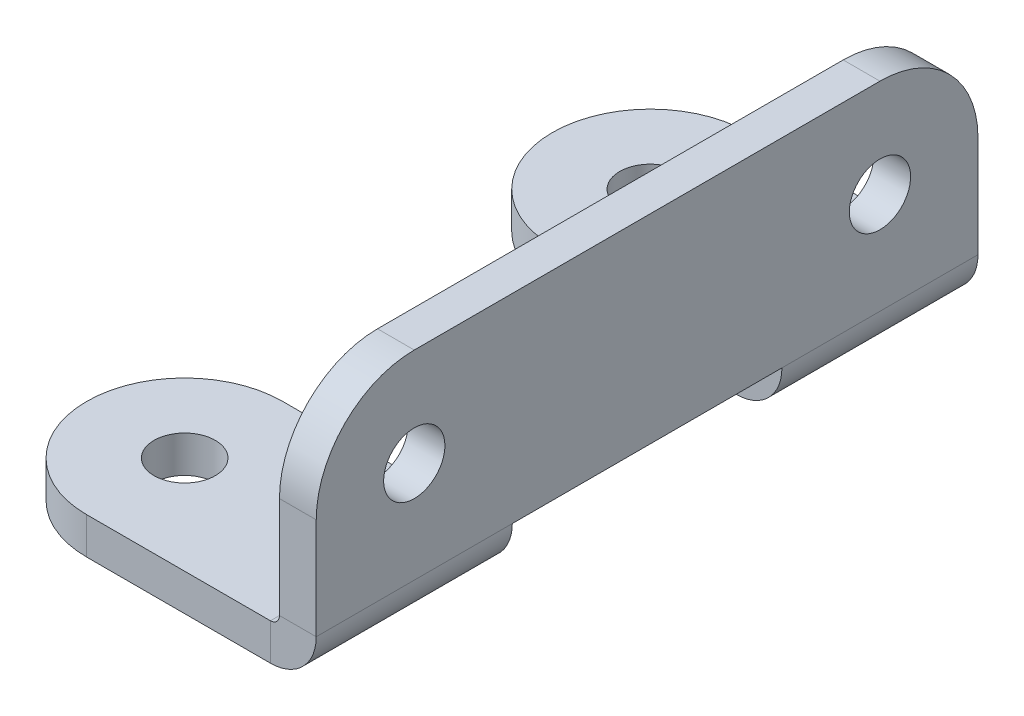
ISO-10303-21;
HEADER;
FILE_DESCRIPTION(('STEP AP214'),'2;1');
FILE_NAME('part.step','',(''),(''),'','','');
FILE_SCHEMA(('AUTOMOTIVE_DESIGN { 1 0 10303 214 1 1 1 1 }'));
ENDSEC;
DATA;
#1=APPLICATION_CONTEXT('core data for automotive mechanical design processes');
#2=APPLICATION_PROTOCOL_DEFINITION('international standard','automotive_design',2000,#1);
#3=PRODUCT_CONTEXT('',#1,'mechanical');
#4=PRODUCT('Part','Part','',(#3));
#5=PRODUCT_RELATED_PRODUCT_CATEGORY('part','',(#4));
#6=PRODUCT_DEFINITION_FORMATION('','',#4);
#7=PRODUCT_DEFINITION_CONTEXT('part definition',#1,'design');
#8=PRODUCT_DEFINITION('design','',#6,#7);
#9=PRODUCT_DEFINITION_SHAPE('','',#8);
#10=(LENGTH_UNIT() NAMED_UNIT(*) SI_UNIT(.MILLI.,.METRE.));
#11=(NAMED_UNIT(*) PLANE_ANGLE_UNIT() SI_UNIT($,.RADIAN.));
#12=(NAMED_UNIT(*) SI_UNIT($,.STERADIAN.) SOLID_ANGLE_UNIT());
#13=UNCERTAINTY_MEASURE_WITH_UNIT(LENGTH_MEASURE(1.E-05),#10,'distance_accuracy_value','');
#14=(GEOMETRIC_REPRESENTATION_CONTEXT(3) GLOBAL_UNCERTAINTY_ASSIGNED_CONTEXT((#13)) GLOBAL_UNIT_ASSIGNED_CONTEXT((#10,
#11,#12)) REPRESENTATION_CONTEXT('',''));
#15=CARTESIAN_POINT('',(0.,0.,0.));
#16=DIRECTION('',(0.,0.,1.));
#17=DIRECTION('',(1.,0.,0.));
#18=AXIS2_PLACEMENT_3D('',#15,#16,#17);
#19=CARTESIAN_POINT('',(18.7366,0.,0.));
#20=DIRECTION('',(-1.,0.,0.));
#21=DIRECTION('',(0.,-1.,0.));
#22=AXIS2_PLACEMENT_3D('',#19,#20,#21);
#23=PLANE('',#22);
#24=DIRECTION('',(0.,0.,1.));
#25=VECTOR('',#24,1.);
#26=CARTESIAN_POINT('',(18.7366,0.736599999999985,-8.));
#27=LINE('',#26,#25);
#28=CARTESIAN_POINT('',(18.7366,0.736599999999985,-30.));
#29=VERTEX_POINT('',#28);
#30=CARTESIAN_POINT('',(18.7366,0.736599999999985,-8.));
#31=VERTEX_POINT('',#30);
#32=EDGE_CURVE('E294',#29,#31,#27,.T.);
#33=ORIENTED_EDGE('',*,*,#32,.F.);
#34=DIRECTION('',(0.,0.,1.));
#35=VECTOR('',#34,1.);
#36=CARTESIAN_POINT('',(18.7366,0.736599999999987,-46.));
#37=LINE('',#36,#35);
#38=CARTESIAN_POINT('',(18.7366,0.736599999999986,-46.));
#39=VERTEX_POINT('',#38);
#40=EDGE_CURVE('E239',#29,#39,#37,.F.);
#41=ORIENTED_EDGE('',*,*,#40,.T.);
#42=DIRECTION('',(0.,-1.,0.));
#43=VECTOR('',#42,1.);
#44=CARTESIAN_POINT('',(18.7366,0.,-46.));
#45=LINE('',#44,#43);
#46=CARTESIAN_POINT('',(18.7366,9.00000000000001,-46.));
#47=VERTEX_POINT('',#46);
#48=EDGE_CURVE('E238',#47,#39,#45,.T.);
#49=ORIENTED_EDGE('',*,*,#48,.F.);
#50=CARTESIAN_POINT('',(18.7366,9.,-38.));
#51=DIRECTION('',(1.,0.,0.));
#52=DIRECTION('',(0.,-1.,0.));
#53=AXIS2_PLACEMENT_3D('',#50,#51,#52);
#54=CIRCLE('',#53,8.);
#55=CARTESIAN_POINT('',(18.7366000000001,17.,-38.));
#56=VERTEX_POINT('',#55);
#57=EDGE_CURVE('E220',#56,#47,#54,.F.);
#58=ORIENTED_EDGE('',*,*,#57,.F.);
#59=DIRECTION('',(0.,0.,-1.));
#60=VECTOR('',#59,1.);
#61=CARTESIAN_POINT('',(18.7366000000001,17.,-38.));
#62=LINE('',#61,#60);
#63=CARTESIAN_POINT('',(18.7366000000001,17.,0.));
#64=VERTEX_POINT('',#63);
#65=EDGE_CURVE('E297',#64,#56,#62,.T.);
#66=ORIENTED_EDGE('',*,*,#65,.F.);
#67=CARTESIAN_POINT('',(18.7366,9.,0.));
#68=DIRECTION('',(-1.,0.,0.));
#69=DIRECTION('',(0.,-1.,0.));
#70=AXIS2_PLACEMENT_3D('',#67,#68,#69);
#71=CIRCLE('',#70,8.);
#72=CARTESIAN_POINT('',(18.7366,9.00000000000001,8.));
#73=VERTEX_POINT('',#72);
#74=EDGE_CURVE('E99',#64,#73,#71,.F.);
#75=ORIENTED_EDGE('',*,*,#74,.T.);
#76=DIRECTION('',(0.,-1.,0.));
#77=VECTOR('',#76,1.);
#78=CARTESIAN_POINT('',(18.7366,0.,8.));
#79=LINE('',#78,#77);
#80=CARTESIAN_POINT('',(18.7366,0.736599999999986,8.));
#81=VERTEX_POINT('',#80);
#82=EDGE_CURVE('E319',#73,#81,#79,.T.);
#83=ORIENTED_EDGE('',*,*,#82,.T.);
#84=DIRECTION('',(0.,0.,-1.));
#85=VECTOR('',#84,1.);
#86=CARTESIAN_POINT('',(18.7366,0.736599999999987,8.));
#87=LINE('',#86,#85);
#88=EDGE_CURVE('E324',#31,#81,#87,.F.);
#89=ORIENTED_EDGE('',*,*,#88,.F.);
#90=EDGE_LOOP('',(#33,#41,#49,#58,#66,#75,#83,#89));
#91=FACE_BOUND('',#90,.T.);
#92=CARTESIAN_POINT('',(18.7366,9.,0.));
#93=DIRECTION('',(-1.,0.,0.));
#94=DIRECTION('',(0.,-1.,0.));
#95=AXIS2_PLACEMENT_3D('',#92,#93,#94);
#96=CIRCLE('',#95,2.5);
#97=CARTESIAN_POINT('',(18.7366,6.5,0.));
#98=VERTEX_POINT('',#97);
#99=EDGE_CURVE('E312',#98,#98,#96,.T.);
#100=ORIENTED_EDGE('',*,*,#99,.T.);
#101=EDGE_LOOP('',(#100));
#102=FACE_BOUND('',#101,.T.);
#103=CARTESIAN_POINT('',(18.7366,9.,-38.));
#104=DIRECTION('',(1.,0.,0.));
#105=DIRECTION('',(0.,-1.,0.));
#106=AXIS2_PLACEMENT_3D('',#103,#104,#105);
#107=CIRCLE('',#106,2.5);
#108=CARTESIAN_POINT('',(18.7366,6.5,-38.));
#109=VERTEX_POINT('',#108);
#110=EDGE_CURVE('E221',#109,#109,#107,.T.);
#111=ORIENTED_EDGE('',*,*,#110,.F.);
#112=EDGE_LOOP('',(#111));
#113=FACE_BOUND('',#112,.T.);
#114=ADVANCED_FACE('F85',(#91,#102,#113),#23,.F.);
#115=CARTESIAN_POINT('',(15.7366,0.,0.));
#116=DIRECTION('',(-1.,0.,0.));
#117=DIRECTION('',(0.,-1.,0.));
#118=AXIS2_PLACEMENT_3D('',#115,#116,#117);
#119=PLANE('',#118);
#120=DIRECTION('',(0.,0.,1.));
#121=VECTOR('',#120,1.);
#122=CARTESIAN_POINT('',(15.7366,0.736599999999997,-46.));
#123=LINE('',#122,#121);
#124=CARTESIAN_POINT('',(15.7366,0.736599999999997,-46.));
#125=VERTEX_POINT('',#124);
#126=CARTESIAN_POINT('',(15.7366,0.736599999999995,-30.));
#127=VERTEX_POINT('',#126);
#128=EDGE_CURVE('E244',#125,#127,#123,.T.);
#129=ORIENTED_EDGE('',*,*,#128,.T.);
#130=DIRECTION('',(0.,0.,1.));
#131=VECTOR('',#130,1.);
#132=CARTESIAN_POINT('',(15.7366,0.736599999999996,-8.));
#133=LINE('',#132,#131);
#134=CARTESIAN_POINT('',(15.7366,0.736599999999995,-8.));
#135=VERTEX_POINT('',#134);
#136=EDGE_CURVE('E230',#127,#135,#133,.T.);
#137=ORIENTED_EDGE('',*,*,#136,.T.);
#138=DIRECTION('',(0.,0.,-1.));
#139=VECTOR('',#138,1.);
#140=CARTESIAN_POINT('',(15.7366,0.736599999999997,8.));
#141=LINE('',#140,#139);
#142=CARTESIAN_POINT('',(15.7366,0.736599999999997,8.));
#143=VERTEX_POINT('',#142);
#144=EDGE_CURVE('E330',#143,#135,#141,.T.);
#145=ORIENTED_EDGE('',*,*,#144,.F.);
#146=DIRECTION('',(0.,1.,0.));
#147=VECTOR('',#146,1.);
#148=CARTESIAN_POINT('',(15.7366,0.,8.));
#149=LINE('',#148,#147);
#150=CARTESIAN_POINT('',(15.7366,9.00000000000002,8.));
#151=VERTEX_POINT('',#150);
#152=EDGE_CURVE('E322',#151,#143,#149,.F.);
#153=ORIENTED_EDGE('',*,*,#152,.F.);
#154=CARTESIAN_POINT('',(15.7366,9.00000000000001,0.));
#155=DIRECTION('',(-1.,0.,0.));
#156=DIRECTION('',(0.,-1.,0.));
#157=AXIS2_PLACEMENT_3D('',#154,#155,#156);
#158=CIRCLE('',#157,8.);
#159=CARTESIAN_POINT('',(15.7366000000001,17.,0.));
#160=VERTEX_POINT('',#159);
#161=EDGE_CURVE('E315',#160,#151,#158,.F.);
#162=ORIENTED_EDGE('',*,*,#161,.F.);
#163=DIRECTION('',(0.,0.,-1.));
#164=VECTOR('',#163,1.);
#165=CARTESIAN_POINT('',(15.7366000000001,17.,-38.));
#166=LINE('',#165,#164);
#167=CARTESIAN_POINT('',(15.7366000000001,17.,-38.));
#168=VERTEX_POINT('',#167);
#169=EDGE_CURVE('E217',#160,#168,#166,.T.);
#170=ORIENTED_EDGE('',*,*,#169,.T.);
#171=CARTESIAN_POINT('',(15.7366,9.00000000000001,-38.));
#172=DIRECTION('',(1.,0.,0.));
#173=DIRECTION('',(0.,-1.,0.));
#174=AXIS2_PLACEMENT_3D('',#171,#172,#173);
#175=CIRCLE('',#174,8.);
#176=CARTESIAN_POINT('',(15.7366,9.00000000000002,-46.));
#177=VERTEX_POINT('',#176);
#178=EDGE_CURVE('E209',#168,#177,#175,.F.);
#179=ORIENTED_EDGE('',*,*,#178,.T.);
#180=DIRECTION('',(0.,1.,0.));
#181=VECTOR('',#180,1.);
#182=CARTESIAN_POINT('',(15.7366,0.,-46.));
#183=LINE('',#182,#181);
#184=EDGE_CURVE('E215',#177,#125,#183,.F.);
#185=ORIENTED_EDGE('',*,*,#184,.T.);
#186=EDGE_LOOP('',(#129,#137,#145,#153,#162,#170,#179,#185));
#187=FACE_BOUND('',#186,.T.);
#188=CARTESIAN_POINT('',(15.7366,9.00000000000001,0.));
#189=DIRECTION('',(-1.,0.,0.));
#190=DIRECTION('',(0.,-1.,0.));
#191=AXIS2_PLACEMENT_3D('',#188,#189,#190);
#192=CIRCLE('',#191,2.5);
#193=CARTESIAN_POINT('',(15.7366,6.50000000000001,0.));
#194=VERTEX_POINT('',#193);
#195=EDGE_CURVE('E305',#194,#194,#192,.T.);
#196=ORIENTED_EDGE('',*,*,#195,.F.);
#197=EDGE_LOOP('',(#196));
#198=FACE_BOUND('',#197,.T.);
#199=CARTESIAN_POINT('',(15.7366,9.00000000000001,-38.));
#200=DIRECTION('',(1.,0.,0.));
#201=DIRECTION('',(0.,-1.,0.));
#202=AXIS2_PLACEMENT_3D('',#199,#200,#201);
#203=CIRCLE('',#202,2.5);
#204=CARTESIAN_POINT('',(15.7366,6.50000000000001,-38.));
#205=VERTEX_POINT('',#204);
#206=EDGE_CURVE('E441',#205,#205,#203,.T.);
#207=ORIENTED_EDGE('',*,*,#206,.T.);
#208=EDGE_LOOP('',(#207));
#209=FACE_BOUND('',#208,.T.);
#210=ADVANCED_FACE('F212',(#187,#198,#209),#119,.T.);
#211=CARTESIAN_POINT('',(18.7366,0.,8.));
#212=DIRECTION('',(0.,0.,-1.));
#213=DIRECTION('',(-1.,0.,0.));
#214=AXIS2_PLACEMENT_3D('',#211,#212,#213);
#215=PLANE('',#214);
#216=DIRECTION('',(-1.,0.,0.));
#217=VECTOR('',#216,1.);
#218=CARTESIAN_POINT('',(25.7366,8.99999999999998,8.));
#219=LINE('',#218,#217);
#220=EDGE_CURVE('E13',#151,#73,#219,.F.);
#221=ORIENTED_EDGE('',*,*,#220,.F.);
#222=ORIENTED_EDGE('',*,*,#152,.T.);
#223=DIRECTION('',(-1.,0.,0.));
#224=VECTOR('',#223,1.);
#225=CARTESIAN_POINT('',(18.7366,0.736599999999987,8.));
#226=LINE('',#225,#224);
#227=EDGE_CURVE('E318',#143,#81,#226,.F.);
#228=ORIENTED_EDGE('',*,*,#227,.T.);
#229=ORIENTED_EDGE('',*,*,#82,.F.);
#230=EDGE_LOOP('',(#221,#222,#228,#229));
#231=FACE_BOUND('',#230,.T.);
#232=ADVANCED_FACE('F433',(#231),#215,.F.);
#233=CARTESIAN_POINT('',(15.,-3.,8.));
#234=DIRECTION('',(0.,0.,1.));
#235=DIRECTION('',(1.,0.,0.));
#236=AXIS2_PLACEMENT_3D('',#233,#234,#235);
#237=PLANE('',#236);
#238=DIRECTION('',(1.,0.,0.));
#239=VECTOR('',#238,1.);
#240=CARTESIAN_POINT('',(15.,0.,8.));
#241=LINE('',#240,#239);
#242=CARTESIAN_POINT('',(0.,0.,8.));
#243=VERTEX_POINT('',#242);
#244=CARTESIAN_POINT('',(15.,0.,8.));
#245=VERTEX_POINT('',#244);
#246=EDGE_CURVE('E354',#243,#245,#241,.T.);
#247=ORIENTED_EDGE('',*,*,#246,.F.);
#248=DIRECTION('',(0.,1.,0.));
#249=VECTOR('',#248,1.);
#250=CARTESIAN_POINT('',(0.,-3.,8.));
#251=LINE('',#250,#249);
#252=CARTESIAN_POINT('',(0.,-3.,8.));
#253=VERTEX_POINT('',#252);
#254=EDGE_CURVE('E372',#253,#243,#251,.T.);
#255=ORIENTED_EDGE('',*,*,#254,.F.);
#256=DIRECTION('',(1.,0.,0.));
#257=VECTOR('',#256,1.);
#258=CARTESIAN_POINT('',(15.,-3.,8.));
#259=LINE('',#258,#257);
#260=CARTESIAN_POINT('',(15.,-3.,8.));
#261=VERTEX_POINT('',#260);
#262=EDGE_CURVE('E359',#253,#261,#259,.T.);
#263=ORIENTED_EDGE('',*,*,#262,.T.);
#264=DIRECTION('',(0.,1.,0.));
#265=VECTOR('',#264,1.);
#266=CARTESIAN_POINT('',(15.,-3.,8.));
#267=LINE('',#266,#265);
#268=EDGE_CURVE('E93',#261,#245,#267,.T.);
#269=ORIENTED_EDGE('',*,*,#268,.T.);
#270=EDGE_LOOP('',(#247,#255,#263,#269));
#271=FACE_BOUND('',#270,.T.);
#272=ADVANCED_FACE('F463',(#271),#237,.T.);
#273=CARTESIAN_POINT('',(0.,-3.,0.));
#274=DIRECTION('',(0.,1.,0.));
#275=DIRECTION('',(0.,0.,1.));
#276=AXIS2_PLACEMENT_3D('',#273,#274,#275);
#277=CYLINDRICAL_SURFACE('',#276,8.);
#278=CARTESIAN_POINT('',(0.,0.,0.));
#279=DIRECTION('',(0.,1.,0.));
#280=DIRECTION('',(0.,0.,1.));
#281=AXIS2_PLACEMENT_3D('',#278,#279,#280);
#282=CIRCLE('',#281,8.);
#283=CARTESIAN_POINT('',(0.,0.,-8.));
#284=VERTEX_POINT('',#283);
#285=EDGE_CURVE('E367',#284,#243,#282,.T.);
#286=ORIENTED_EDGE('',*,*,#285,.F.);
#287=DIRECTION('',(0.,1.,0.));
#288=VECTOR('',#287,1.);
#289=CARTESIAN_POINT('',(0.,-3.,-8.));
#290=LINE('',#289,#288);
#291=CARTESIAN_POINT('',(0.,-3.,-8.));
#292=VERTEX_POINT('',#291);
#293=EDGE_CURVE('E134',#292,#284,#290,.T.);
#294=ORIENTED_EDGE('',*,*,#293,.F.);
#295=CARTESIAN_POINT('',(0.,-3.,0.));
#296=DIRECTION('',(0.,1.,0.));
#297=DIRECTION('',(0.,0.,1.));
#298=AXIS2_PLACEMENT_3D('',#295,#296,#297);
#299=CIRCLE('',#298,8.);
#300=EDGE_CURVE('E357',#292,#253,#299,.T.);
#301=ORIENTED_EDGE('',*,*,#300,.T.);
#302=ORIENTED_EDGE('',*,*,#254,.T.);
#303=EDGE_LOOP('',(#286,#294,#301,#302));
#304=FACE_BOUND('',#303,.T.);
#305=ADVANCED_FACE('F485',(#304),#277,.T.);
#306=CARTESIAN_POINT('',(15.,-3.,-8.));
#307=DIRECTION('',(0.,0.,-1.));
#308=DIRECTION('',(-1.,0.,0.));
#309=AXIS2_PLACEMENT_3D('',#306,#307,#308);
#310=PLANE('',#309);
#311=DIRECTION('',(-1.,0.,0.));
#312=VECTOR('',#311,1.);
#313=CARTESIAN_POINT('',(15.,0.,-8.));
#314=LINE('',#313,#312);
#315=CARTESIAN_POINT('',(15.,0.,-8.));
#316=VERTEX_POINT('',#315);
#317=EDGE_CURVE('E364',#316,#284,#314,.T.);
#318=ORIENTED_EDGE('',*,*,#317,.F.);
#319=DIRECTION('',(0.,1.,0.));
#320=VECTOR('',#319,1.);
#321=CARTESIAN_POINT('',(15.,-3.,-8.));
#322=LINE('',#321,#320);
#323=CARTESIAN_POINT('',(15.,-3.,-8.));
#324=VERTEX_POINT('',#323);
#325=EDGE_CURVE('E361',#324,#316,#322,.T.);
#326=ORIENTED_EDGE('',*,*,#325,.F.);
#327=DIRECTION('',(-1.,0.,0.));
#328=VECTOR('',#327,1.);
#329=CARTESIAN_POINT('',(15.,-3.,-8.));
#330=LINE('',#329,#328);
#331=EDGE_CURVE('E353',#324,#292,#330,.T.);
#332=ORIENTED_EDGE('',*,*,#331,.T.);
#333=ORIENTED_EDGE('',*,*,#293,.T.);
#334=EDGE_LOOP('',(#318,#326,#332,#333));
#335=FACE_BOUND('',#334,.T.);
#336=ADVANCED_FACE('F87',(#335),#310,.T.);
#337=CARTESIAN_POINT('',(0.,-3.,0.));
#338=DIRECTION('',(0.,1.,0.));
#339=DIRECTION('',(0.,0.,1.));
#340=AXIS2_PLACEMENT_3D('',#337,#338,#339);
#341=PLANE('',#340);
#342=CARTESIAN_POINT('',(0.,-3.,0.));
#343=DIRECTION('',(0.,1.,0.));
#344=DIRECTION('',(0.,0.,1.));
#345=AXIS2_PLACEMENT_3D('',#342,#343,#344);
#346=CIRCLE('',#345,2.5);
#347=CARTESIAN_POINT('',(0.,-3.,2.5));
#348=VERTEX_POINT('',#347);
#349=EDGE_CURVE('E346',#348,#348,#346,.T.);
#350=ORIENTED_EDGE('',*,*,#349,.T.);
#351=EDGE_LOOP('',(#350));
#352=FACE_BOUND('',#351,.T.);
#353=DIRECTION('',(0.,0.,-1.));
#354=VECTOR('',#353,1.);
#355=CARTESIAN_POINT('',(15.,-3.,8.));
#356=LINE('',#355,#354);
#357=EDGE_CURVE('E108',#261,#324,#356,.T.);
#358=ORIENTED_EDGE('',*,*,#357,.F.);
#359=ORIENTED_EDGE('',*,*,#262,.F.);
#360=ORIENTED_EDGE('',*,*,#300,.F.);
#361=ORIENTED_EDGE('',*,*,#331,.F.);
#362=EDGE_LOOP('',(#358,#359,#360,#361));
#363=FACE_BOUND('',#362,.T.);
#364=ADVANCED_FACE('F477',(#352,#363),#341,.F.);
#365=CARTESIAN_POINT('',(0.,0.,0.));
#366=DIRECTION('',(0.,1.,0.));
#367=DIRECTION('',(0.,0.,1.));
#368=AXIS2_PLACEMENT_3D('',#365,#366,#367);
#369=PLANE('',#368);
#370=CARTESIAN_POINT('',(0.,0.,0.));
#371=DIRECTION('',(0.,1.,0.));
#372=DIRECTION('',(0.,0.,1.));
#373=AXIS2_PLACEMENT_3D('',#370,#371,#372);
#374=CIRCLE('',#373,2.5);
#375=CARTESIAN_POINT('',(0.,0.,2.5));
#376=VERTEX_POINT('',#375);
#377=EDGE_CURVE('E337',#376,#376,#374,.T.);
#378=ORIENTED_EDGE('',*,*,#377,.F.);
#379=EDGE_LOOP('',(#378));
#380=FACE_BOUND('',#379,.T.);
#381=DIRECTION('',(0.,0.,-1.));
#382=VECTOR('',#381,1.);
#383=CARTESIAN_POINT('',(15.,0.,8.));
#384=LINE('',#383,#382);
#385=EDGE_CURVE('E349',#245,#316,#384,.T.);
#386=ORIENTED_EDGE('',*,*,#385,.T.);
#387=ORIENTED_EDGE('',*,*,#317,.T.);
#388=ORIENTED_EDGE('',*,*,#285,.T.);
#389=ORIENTED_EDGE('',*,*,#246,.T.);
#390=EDGE_LOOP('',(#386,#387,#388,#389));
#391=FACE_BOUND('',#390,.T.);
#392=ADVANCED_FACE('F475',(#380,#391),#369,.T.);
#393=CARTESIAN_POINT('',(0.,-3.,0.));
#394=DIRECTION('',(0.,1.,0.));
#395=DIRECTION('',(0.,0.,1.));
#396=AXIS2_PLACEMENT_3D('',#393,#394,#395);
#397=CYLINDRICAL_SURFACE('',#396,2.5);
#398=ORIENTED_EDGE('',*,*,#349,.F.);
#399=EDGE_LOOP('',(#398));
#400=FACE_BOUND('',#399,.T.);
#401=ORIENTED_EDGE('',*,*,#377,.T.);
#402=EDGE_LOOP('',(#401));
#403=FACE_BOUND('',#402,.T.);
#404=ADVANCED_FACE('F470',(#400,#403),#397,.F.);
#405=CARTESIAN_POINT('',(15.,0.736599999999999,8.));
#406=DIRECTION('',(0.,0.,1.));
#407=DIRECTION('',(0.,-1.,0.));
#408=AXIS2_PLACEMENT_3D('',#405,#406,#407);
#409=PLANE('',#408);
#410=ORIENTED_EDGE('',*,*,#227,.F.);
#411=CARTESIAN_POINT('',(15.,0.736599999999999,8.));
#412=DIRECTION('',(0.,0.,-1.));
#413=DIRECTION('',(0.,1.,0.));
#414=AXIS2_PLACEMENT_3D('',#411,#412,#413);
#415=CIRCLE('',#414,0.736600000000002);
#416=EDGE_CURVE('E341',#245,#143,#415,.F.);
#417=ORIENTED_EDGE('',*,*,#416,.F.);
#418=ORIENTED_EDGE('',*,*,#268,.F.);
#419=CARTESIAN_POINT('',(15.,0.736599999999999,8.));
#420=DIRECTION('',(0.,0.,-1.));
#421=DIRECTION('',(0.,1.,0.));
#422=AXIS2_PLACEMENT_3D('',#419,#420,#421);
#423=CIRCLE('',#422,3.7366);
#424=EDGE_CURVE('E334',#261,#81,#423,.F.);
#425=ORIENTED_EDGE('',*,*,#424,.T.);
#426=EDGE_LOOP('',(#410,#417,#418,#425));
#427=FACE_BOUND('',#426,.T.);
#428=ADVANCED_FACE('F430',(#427),#409,.T.);
#429=CARTESIAN_POINT('',(15.,0.736599999999998,-8.));
#430=DIRECTION('',(0.,0.,1.));
#431=DIRECTION('',(0.,-1.,0.));
#432=AXIS2_PLACEMENT_3D('',#429,#430,#431);
#433=PLANE('',#432);
#434=CARTESIAN_POINT('',(15.,0.736599999999998,-8.));
#435=DIRECTION('',(0.,0.,-1.));
#436=DIRECTION('',(0.,1.,0.));
#437=AXIS2_PLACEMENT_3D('',#434,#435,#436);
#438=CIRCLE('',#437,0.736600000000002);
#439=EDGE_CURVE('E321',#135,#316,#438,.T.);
#440=ORIENTED_EDGE('',*,*,#439,.F.);
#441=DIRECTION('',(-1.,0.,0.));
#442=VECTOR('',#441,1.);
#443=CARTESIAN_POINT('',(15.7366,0.736599999999995,-8.));
#444=LINE('',#443,#442);
#445=EDGE_CURVE('E327',#135,#31,#444,.F.);
#446=ORIENTED_EDGE('',*,*,#445,.T.);
#447=CARTESIAN_POINT('',(15.,0.736599999999998,-8.));
#448=DIRECTION('',(0.,0.,-1.));
#449=DIRECTION('',(0.,1.,0.));
#450=AXIS2_PLACEMENT_3D('',#447,#448,#449);
#451=CIRCLE('',#450,3.7366);
#452=EDGE_CURVE('E338',#31,#324,#451,.T.);
#453=ORIENTED_EDGE('',*,*,#452,.T.);
#454=ORIENTED_EDGE('',*,*,#325,.T.);
#455=EDGE_LOOP('',(#440,#446,#453,#454));
#456=FACE_BOUND('',#455,.T.);
#457=ADVANCED_FACE('F378',(#456),#433,.F.);
#458=CARTESIAN_POINT('',(15.,0.736599999999998,-8.));
#459=DIRECTION('',(0.,0.,-1.));
#460=DIRECTION('',(1.,0.,0.));
#461=AXIS2_PLACEMENT_3D('',#458,#459,#460);
#462=CYLINDRICAL_SURFACE('',#461,3.7366);
#463=ORIENTED_EDGE('',*,*,#357,.T.);
#464=ORIENTED_EDGE('',*,*,#452,.F.);
#465=ORIENTED_EDGE('',*,*,#88,.T.);
#466=ORIENTED_EDGE('',*,*,#424,.F.);
#467=EDGE_LOOP('',(#463,#464,#465,#466));
#468=FACE_BOUND('',#467,.T.);
#469=ADVANCED_FACE('F427',(#468),#462,.T.);
#470=CARTESIAN_POINT('',(15.,0.736599999999998,-8.));
#471=DIRECTION('',(0.,0.,-1.));
#472=DIRECTION('',(1.,0.,0.));
#473=AXIS2_PLACEMENT_3D('',#470,#471,#472);
#474=CYLINDRICAL_SURFACE('',#473,0.736600000000002);
#475=ORIENTED_EDGE('',*,*,#385,.F.);
#476=ORIENTED_EDGE('',*,*,#416,.T.);
#477=ORIENTED_EDGE('',*,*,#144,.T.);
#478=ORIENTED_EDGE('',*,*,#439,.T.);
#479=EDGE_LOOP('',(#475,#476,#477,#478));
#480=FACE_BOUND('',#479,.T.);
#481=ADVANCED_FACE('F383',(#480),#474,.F.);
#482=CARTESIAN_POINT('',(25.7366,8.99999999999998,0.));
#483=DIRECTION('',(-1.,0.,0.));
#484=DIRECTION('',(0.,-1.,0.));
#485=AXIS2_PLACEMENT_3D('',#482,#483,#484);
#486=CYLINDRICAL_SURFACE('',#485,8.);
#487=ORIENTED_EDGE('',*,*,#74,.F.);
#488=DIRECTION('',(-1.,0.,0.));
#489=VECTOR('',#488,1.);
#490=CARTESIAN_POINT('',(18.7366000000001,17.,0.));
#491=LINE('',#490,#489);
#492=EDGE_CURVE('E306',#64,#160,#491,.T.);
#493=ORIENTED_EDGE('',*,*,#492,.T.);
#494=ORIENTED_EDGE('',*,*,#161,.T.);
#495=ORIENTED_EDGE('',*,*,#220,.T.);
#496=EDGE_LOOP('',(#487,#493,#494,#495));
#497=FACE_BOUND('',#496,.T.);
#498=ADVANCED_FACE('F434',(#497),#486,.T.);
#499=CARTESIAN_POINT('',(25.7366,8.99999999999998,0.));
#500=DIRECTION('',(-1.,0.,0.));
#501=DIRECTION('',(0.,-1.,0.));
#502=AXIS2_PLACEMENT_3D('',#499,#500,#501);
#503=CYLINDRICAL_SURFACE('',#502,2.5);
#504=ORIENTED_EDGE('',*,*,#195,.T.);
#505=EDGE_LOOP('',(#504));
#506=FACE_BOUND('',#505,.T.);
#507=ORIENTED_EDGE('',*,*,#99,.F.);
#508=EDGE_LOOP('',(#507));
#509=FACE_BOUND('',#508,.T.);
#510=ADVANCED_FACE('F530',(#506,#509),#503,.F.);
#511=CARTESIAN_POINT('',(18.7366000000001,17.,-38.));
#512=DIRECTION('',(0.,1.,0.));
#513=DIRECTION('',(-1.,0.,0.));
#514=AXIS2_PLACEMENT_3D('',#511,#512,#513);
#515=PLANE('',#514);
#516=ORIENTED_EDGE('',*,*,#169,.F.);
#517=ORIENTED_EDGE('',*,*,#492,.F.);
#518=ORIENTED_EDGE('',*,*,#65,.T.);
#519=DIRECTION('',(-1.,0.,0.));
#520=VECTOR('',#519,1.);
#521=CARTESIAN_POINT('',(18.7366000000001,17.,-38.));
#522=LINE('',#521,#520);
#523=EDGE_CURVE('E303',#56,#168,#522,.T.);
#524=ORIENTED_EDGE('',*,*,#523,.T.);
#525=EDGE_LOOP('',(#516,#517,#518,#524));
#526=FACE_BOUND('',#525,.T.);
#527=ADVANCED_FACE('F437',(#526),#515,.T.);
#528=CARTESIAN_POINT('',(18.7366,0.736599999999985,-8.));
#529=DIRECTION('',(0.,-1.,0.));
#530=DIRECTION('',(1.,0.,0.));
#531=AXIS2_PLACEMENT_3D('',#528,#529,#530);
#532=PLANE('',#531);
#533=ORIENTED_EDGE('',*,*,#136,.F.);
#534=DIRECTION('',(-1.,0.,0.));
#535=VECTOR('',#534,1.);
#536=CARTESIAN_POINT('',(18.7366,0.736599999999985,-30.));
#537=LINE('',#536,#535);
#538=EDGE_CURVE('E299',#29,#127,#537,.T.);
#539=ORIENTED_EDGE('',*,*,#538,.F.);
#540=ORIENTED_EDGE('',*,*,#32,.T.);
#541=ORIENTED_EDGE('',*,*,#445,.F.);
#542=EDGE_LOOP('',(#533,#539,#540,#541));
#543=FACE_BOUND('',#542,.T.);
#544=ADVANCED_FACE('F388',(#543),#532,.T.);
#545=CARTESIAN_POINT('',(25.7366,8.99999999999998,-38.));
#546=DIRECTION('',(-1.,0.,0.));
#547=DIRECTION('',(0.,-1.,0.));
#548=AXIS2_PLACEMENT_3D('',#545,#546,#547);
#549=CYLINDRICAL_SURFACE('',#548,8.);
#550=ORIENTED_EDGE('',*,*,#178,.F.);
#551=ORIENTED_EDGE('',*,*,#523,.F.);
#552=ORIENTED_EDGE('',*,*,#57,.T.);
#553=DIRECTION('',(-1.,0.,0.));
#554=VECTOR('',#553,1.);
#555=CARTESIAN_POINT('',(25.7366,8.99999999999998,-46.));
#556=LINE('',#555,#554);
#557=EDGE_CURVE('E224',#177,#47,#556,.F.);
#558=ORIENTED_EDGE('',*,*,#557,.F.);
#559=EDGE_LOOP('',(#550,#551,#552,#558));
#560=FACE_BOUND('',#559,.T.);
#561=ADVANCED_FACE('F225',(#560),#549,.T.);
#562=CARTESIAN_POINT('',(18.7366,0.,-46.));
#563=DIRECTION('',(0.,0.,1.));
#564=DIRECTION('',(-1.,0.,0.));
#565=AXIS2_PLACEMENT_3D('',#562,#563,#564);
#566=PLANE('',#565);
#567=ORIENTED_EDGE('',*,*,#557,.T.);
#568=ORIENTED_EDGE('',*,*,#48,.T.);
#569=DIRECTION('',(-1.,0.,0.));
#570=VECTOR('',#569,1.);
#571=CARTESIAN_POINT('',(18.7366,0.736599999999987,-46.));
#572=LINE('',#571,#570);
#573=EDGE_CURVE('E236',#125,#39,#572,.F.);
#574=ORIENTED_EDGE('',*,*,#573,.F.);
#575=ORIENTED_EDGE('',*,*,#184,.F.);
#576=EDGE_LOOP('',(#567,#568,#574,#575));
#577=FACE_BOUND('',#576,.T.);
#578=ADVANCED_FACE('F234',(#577),#566,.F.);
#579=CARTESIAN_POINT('',(15.,-3.,-46.));
#580=DIRECTION('',(0.,0.,-1.));
#581=DIRECTION('',(1.,0.,0.));
#582=AXIS2_PLACEMENT_3D('',#579,#580,#581);
#583=PLANE('',#582);
#584=DIRECTION('',(1.,0.,0.));
#585=VECTOR('',#584,1.);
#586=CARTESIAN_POINT('',(15.,0.,-46.));
#587=LINE('',#586,#585);
#588=CARTESIAN_POINT('',(0.,0.,-46.));
#589=VERTEX_POINT('',#588);
#590=CARTESIAN_POINT('',(15.,0.,-46.));
#591=VERTEX_POINT('',#590);
#592=EDGE_CURVE('E268',#589,#591,#587,.T.);
#593=ORIENTED_EDGE('',*,*,#592,.T.);
#594=DIRECTION('',(0.,1.,0.));
#595=VECTOR('',#594,1.);
#596=CARTESIAN_POINT('',(15.,-3.,-46.));
#597=LINE('',#596,#595);
#598=CARTESIAN_POINT('',(15.,-3.,-46.));
#599=VERTEX_POINT('',#598);
#600=EDGE_CURVE('E231',#599,#591,#597,.T.);
#601=ORIENTED_EDGE('',*,*,#600,.F.);
#602=DIRECTION('',(1.,0.,0.));
#603=VECTOR('',#602,1.);
#604=CARTESIAN_POINT('',(15.,-3.,-46.));
#605=LINE('',#604,#603);
#606=CARTESIAN_POINT('',(0.,-3.,-46.));
#607=VERTEX_POINT('',#606);
#608=EDGE_CURVE('E272',#607,#599,#605,.T.);
#609=ORIENTED_EDGE('',*,*,#608,.F.);
#610=DIRECTION('',(0.,1.,0.));
#611=VECTOR('',#610,1.);
#612=CARTESIAN_POINT('',(0.,-3.,-46.));
#613=LINE('',#612,#611);
#614=EDGE_CURVE('E286',#607,#589,#613,.T.);
#615=ORIENTED_EDGE('',*,*,#614,.T.);
#616=EDGE_LOOP('',(#593,#601,#609,#615));
#617=FACE_BOUND('',#616,.T.);
#618=ADVANCED_FACE('F414',(#617),#583,.T.);
#619=CARTESIAN_POINT('',(0.,-3.,-38.));
#620=DIRECTION('',(0.,1.,0.));
#621=DIRECTION('',(0.,0.,-1.));
#622=AXIS2_PLACEMENT_3D('',#619,#620,#621);
#623=CYLINDRICAL_SURFACE('',#622,8.);
#624=CARTESIAN_POINT('',(0.,0.,-38.));
#625=DIRECTION('',(0.,-1.,0.));
#626=DIRECTION('',(0.,0.,-1.));
#627=AXIS2_PLACEMENT_3D('',#624,#625,#626);
#628=CIRCLE('',#627,8.);
#629=CARTESIAN_POINT('',(0.,0.,-30.));
#630=VERTEX_POINT('',#629);
#631=EDGE_CURVE('E280',#630,#589,#628,.T.);
#632=ORIENTED_EDGE('',*,*,#631,.T.);
#633=ORIENTED_EDGE('',*,*,#614,.F.);
#634=CARTESIAN_POINT('',(0.,-3.,-38.));
#635=DIRECTION('',(0.,-1.,0.));
#636=DIRECTION('',(0.,0.,-1.));
#637=AXIS2_PLACEMENT_3D('',#634,#635,#636);
#638=CIRCLE('',#637,8.);
#639=CARTESIAN_POINT('',(0.,-3.,-30.));
#640=VERTEX_POINT('',#639);
#641=EDGE_CURVE('E270',#640,#607,#638,.T.);
#642=ORIENTED_EDGE('',*,*,#641,.F.);
#643=DIRECTION('',(0.,1.,0.));
#644=VECTOR('',#643,1.);
#645=CARTESIAN_POINT('',(0.,-3.,-30.));
#646=LINE('',#645,#644);
#647=EDGE_CURVE('E289',#640,#630,#646,.T.);
#648=ORIENTED_EDGE('',*,*,#647,.T.);
#649=EDGE_LOOP('',(#632,#633,#642,#648));
#650=FACE_BOUND('',#649,.T.);
#651=ADVANCED_FACE('F410',(#650),#623,.T.);
#652=CARTESIAN_POINT('',(15.,-3.,-30.));
#653=DIRECTION('',(0.,0.,1.));
#654=DIRECTION('',(-1.,0.,0.));
#655=AXIS2_PLACEMENT_3D('',#652,#653,#654);
#656=PLANE('',#655);
#657=DIRECTION('',(-1.,0.,0.));
#658=VECTOR('',#657,1.);
#659=CARTESIAN_POINT('',(15.,0.,-30.));
#660=LINE('',#659,#658);
#661=CARTESIAN_POINT('',(15.,0.,-30.));
#662=VERTEX_POINT('',#661);
#663=EDGE_CURVE('E278',#662,#630,#660,.T.);
#664=ORIENTED_EDGE('',*,*,#663,.T.);
#665=ORIENTED_EDGE('',*,*,#647,.F.);
#666=DIRECTION('',(-1.,0.,0.));
#667=VECTOR('',#666,1.);
#668=CARTESIAN_POINT('',(15.,-3.,-30.));
#669=LINE('',#668,#667);
#670=CARTESIAN_POINT('',(15.,-3.,-30.));
#671=VERTEX_POINT('',#670);
#672=EDGE_CURVE('E267',#671,#640,#669,.T.);
#673=ORIENTED_EDGE('',*,*,#672,.F.);
#674=DIRECTION('',(0.,1.,0.));
#675=VECTOR('',#674,1.);
#676=CARTESIAN_POINT('',(15.,-3.,-30.));
#677=LINE('',#676,#675);
#678=EDGE_CURVE('E275',#671,#662,#677,.T.);
#679=ORIENTED_EDGE('',*,*,#678,.T.);
#680=EDGE_LOOP('',(#664,#665,#673,#679));
#681=FACE_BOUND('',#680,.T.);
#682=ADVANCED_FACE('F404',(#681),#656,.T.);
#683=CARTESIAN_POINT('',(0.,-3.,-38.));
#684=DIRECTION('',(0.,1.,0.));
#685=DIRECTION('',(0.,0.,-1.));
#686=AXIS2_PLACEMENT_3D('',#683,#684,#685);
#687=PLANE('',#686);
#688=CARTESIAN_POINT('',(0.,-3.,-38.));
#689=DIRECTION('',(0.,-1.,0.));
#690=DIRECTION('',(0.,0.,-1.));
#691=AXIS2_PLACEMENT_3D('',#688,#689,#690);
#692=CIRCLE('',#691,2.5);
#693=CARTESIAN_POINT('',(0.,-3.,-40.5));
#694=VERTEX_POINT('',#693);
#695=EDGE_CURVE('E258',#694,#694,#692,.T.);
#696=ORIENTED_EDGE('',*,*,#695,.F.);
#697=EDGE_LOOP('',(#696));
#698=FACE_BOUND('',#697,.T.);
#699=DIRECTION('',(0.,0.,1.));
#700=VECTOR('',#699,1.);
#701=CARTESIAN_POINT('',(15.,-3.,-46.));
#702=LINE('',#701,#700);
#703=EDGE_CURVE('E264',#599,#671,#702,.T.);
#704=ORIENTED_EDGE('',*,*,#703,.T.);
#705=ORIENTED_EDGE('',*,*,#672,.T.);
#706=ORIENTED_EDGE('',*,*,#641,.T.);
#707=ORIENTED_EDGE('',*,*,#608,.T.);
#708=EDGE_LOOP('',(#704,#705,#706,#707));
#709=FACE_BOUND('',#708,.T.);
#710=ADVANCED_FACE('F417',(#698,#709),#687,.F.);
#711=CARTESIAN_POINT('',(0.,0.,-38.));
#712=DIRECTION('',(0.,1.,0.));
#713=DIRECTION('',(0.,0.,-1.));
#714=AXIS2_PLACEMENT_3D('',#711,#712,#713);
#715=PLANE('',#714);
#716=CARTESIAN_POINT('',(0.,0.,-38.));
#717=DIRECTION('',(0.,-1.,0.));
#718=DIRECTION('',(0.,0.,-1.));
#719=AXIS2_PLACEMENT_3D('',#716,#717,#718);
#720=CIRCLE('',#719,2.5);
#721=CARTESIAN_POINT('',(0.,0.,-40.5));
#722=VERTEX_POINT('',#721);
#723=EDGE_CURVE('E252',#722,#722,#720,.T.);
#724=ORIENTED_EDGE('',*,*,#723,.T.);
#725=EDGE_LOOP('',(#724));
#726=FACE_BOUND('',#725,.T.);
#727=DIRECTION('',(0.,0.,1.));
#728=VECTOR('',#727,1.);
#729=CARTESIAN_POINT('',(15.,0.,-46.));
#730=LINE('',#729,#728);
#731=EDGE_CURVE('E261',#591,#662,#730,.T.);
#732=ORIENTED_EDGE('',*,*,#731,.F.);
#733=ORIENTED_EDGE('',*,*,#592,.F.);
#734=ORIENTED_EDGE('',*,*,#631,.F.);
#735=ORIENTED_EDGE('',*,*,#663,.F.);
#736=EDGE_LOOP('',(#732,#733,#734,#735));
#737=FACE_BOUND('',#736,.T.);
#738=ADVANCED_FACE('F407',(#726,#737),#715,.T.);
#739=CARTESIAN_POINT('',(0.,-3.,-38.));
#740=DIRECTION('',(0.,1.,0.));
#741=DIRECTION('',(0.,0.,-1.));
#742=AXIS2_PLACEMENT_3D('',#739,#740,#741);
#743=CYLINDRICAL_SURFACE('',#742,2.5);
#744=ORIENTED_EDGE('',*,*,#695,.T.);
#745=EDGE_LOOP('',(#744));
#746=FACE_BOUND('',#745,.T.);
#747=ORIENTED_EDGE('',*,*,#723,.F.);
#748=EDGE_LOOP('',(#747));
#749=FACE_BOUND('',#748,.T.);
#750=ADVANCED_FACE('F591',(#746,#749),#743,.F.);
#751=CARTESIAN_POINT('',(15.,0.736599999999999,-46.));
#752=DIRECTION('',(0.,0.,-1.));
#753=DIRECTION('',(0.,-1.,0.));
#754=AXIS2_PLACEMENT_3D('',#751,#752,#753);
#755=PLANE('',#754);
#756=ORIENTED_EDGE('',*,*,#573,.T.);
#757=CARTESIAN_POINT('',(15.,0.736599999999999,-46.));
#758=DIRECTION('',(0.,0.,-1.));
#759=DIRECTION('',(0.,1.,0.));
#760=AXIS2_PLACEMENT_3D('',#757,#758,#759);
#761=CIRCLE('',#760,3.7366);
#762=EDGE_CURVE('E250',#599,#39,#761,.F.);
#763=ORIENTED_EDGE('',*,*,#762,.F.);
#764=ORIENTED_EDGE('',*,*,#600,.T.);
#765=CARTESIAN_POINT('',(15.,0.736599999999999,-46.));
#766=DIRECTION('',(0.,0.,-1.));
#767=DIRECTION('',(0.,1.,0.));
#768=AXIS2_PLACEMENT_3D('',#765,#766,#767);
#769=CIRCLE('',#768,0.736600000000002);
#770=EDGE_CURVE('E255',#591,#125,#769,.F.);
#771=ORIENTED_EDGE('',*,*,#770,.T.);
#772=EDGE_LOOP('',(#756,#763,#764,#771));
#773=FACE_BOUND('',#772,.T.);
#774=ADVANCED_FACE('F599',(#773),#755,.T.);
#775=CARTESIAN_POINT('',(15.,0.736599999999998,-30.));
#776=DIRECTION('',(0.,0.,-1.));
#777=DIRECTION('',(0.,-1.,0.));
#778=AXIS2_PLACEMENT_3D('',#775,#776,#777);
#779=PLANE('',#778);
#780=CARTESIAN_POINT('',(15.,0.736599999999998,-30.));
#781=DIRECTION('',(0.,0.,-1.));
#782=DIRECTION('',(0.,1.,0.));
#783=AXIS2_PLACEMENT_3D('',#780,#781,#782);
#784=CIRCLE('',#783,0.736600000000002);
#785=EDGE_CURVE('E241',#127,#662,#784,.T.);
#786=ORIENTED_EDGE('',*,*,#785,.T.);
#787=ORIENTED_EDGE('',*,*,#678,.F.);
#788=CARTESIAN_POINT('',(15.,0.736599999999998,-30.));
#789=DIRECTION('',(0.,0.,-1.));
#790=DIRECTION('',(0.,1.,0.));
#791=AXIS2_PLACEMENT_3D('',#788,#789,#790);
#792=CIRCLE('',#791,3.7366);
#793=EDGE_CURVE('E253',#29,#671,#792,.T.);
#794=ORIENTED_EDGE('',*,*,#793,.F.);
#795=ORIENTED_EDGE('',*,*,#538,.T.);
#796=EDGE_LOOP('',(#786,#787,#794,#795));
#797=FACE_BOUND('',#796,.T.);
#798=ADVANCED_FACE('F393',(#797),#779,.F.);
#799=CARTESIAN_POINT('',(15.,0.736599999999998,-30.));
#800=DIRECTION('',(0.,0.,1.));
#801=DIRECTION('',(1.,0.,0.));
#802=AXIS2_PLACEMENT_3D('',#799,#800,#801);
#803=CYLINDRICAL_SURFACE('',#802,3.7366);
#804=ORIENTED_EDGE('',*,*,#703,.F.);
#805=ORIENTED_EDGE('',*,*,#762,.T.);
#806=ORIENTED_EDGE('',*,*,#40,.F.);
#807=ORIENTED_EDGE('',*,*,#793,.T.);
#808=EDGE_LOOP('',(#804,#805,#806,#807));
#809=FACE_BOUND('',#808,.T.);
#810=ADVANCED_FACE('F420',(#809),#803,.T.);
#811=CARTESIAN_POINT('',(15.,0.736599999999998,-30.));
#812=DIRECTION('',(0.,0.,1.));
#813=DIRECTION('',(1.,0.,0.));
#814=AXIS2_PLACEMENT_3D('',#811,#812,#813);
#815=CYLINDRICAL_SURFACE('',#814,0.736600000000002);
#816=ORIENTED_EDGE('',*,*,#731,.T.);
#817=ORIENTED_EDGE('',*,*,#785,.F.);
#818=ORIENTED_EDGE('',*,*,#128,.F.);
#819=ORIENTED_EDGE('',*,*,#770,.F.);
#820=EDGE_LOOP('',(#816,#817,#818,#819));
#821=FACE_BOUND('',#820,.T.);
#822=ADVANCED_FACE('F397',(#821),#815,.F.);
#823=CARTESIAN_POINT('',(25.7366,8.99999999999998,-38.));
#824=DIRECTION('',(-1.,0.,0.));
#825=DIRECTION('',(0.,-1.,0.));
#826=AXIS2_PLACEMENT_3D('',#823,#824,#825);
#827=CYLINDRICAL_SURFACE('',#826,2.5);
#828=ORIENTED_EDGE('',*,*,#206,.F.);
#829=EDGE_LOOP('',(#828));
#830=FACE_BOUND('',#829,.T.);
#831=ORIENTED_EDGE('',*,*,#110,.T.);
#832=EDGE_LOOP('',(#831));
#833=FACE_BOUND('',#832,.T.);
#834=ADVANCED_FACE('F446',(#830,#833),#827,.F.);
#835=CLOSED_SHELL('',(#114,#210,#232,#272,#305,#336,#364,#392,#404,#428,#457,#469,#481,#498,
#510,#527,#544,#561,#578,#618,#651,#682,#710,#738,#750,#774,#798,#810,#822,#834));
#836=MANIFOLD_SOLID_BREP('B2',#835);
#837=ADVANCED_BREP_SHAPE_REPRESENTATION('',(#18,#836),#14);
#838=SHAPE_DEFINITION_REPRESENTATION(#9,#837);
ENDSEC;
END-ISO-10303-21;
